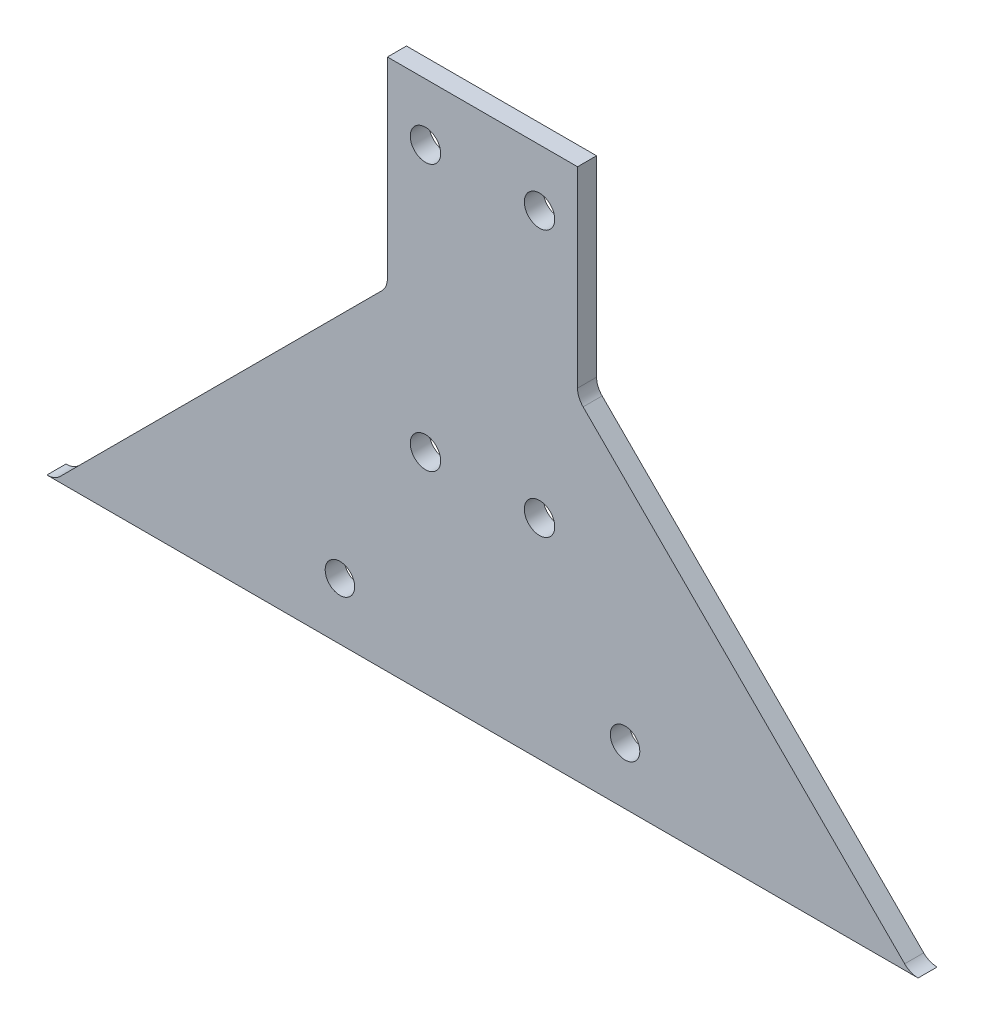
ISO-10303-21;
HEADER;
FILE_DESCRIPTION(('STEP AP214'),'2;1');
FILE_NAME('part.step','',(''),(''),'','','');
FILE_SCHEMA(('AUTOMOTIVE_DESIGN { 1 0 10303 214 1 1 1 1 }'));
ENDSEC;
DATA;
#1=APPLICATION_CONTEXT('core data for automotive mechanical design processes');
#2=APPLICATION_PROTOCOL_DEFINITION('international standard','automotive_design',2000,#1);
#3=PRODUCT_CONTEXT('',#1,'mechanical');
#4=PRODUCT('Part','Part','',(#3));
#5=PRODUCT_RELATED_PRODUCT_CATEGORY('part','',(#4));
#6=PRODUCT_DEFINITION_FORMATION('','',#4);
#7=PRODUCT_DEFINITION_CONTEXT('part definition',#1,'design');
#8=PRODUCT_DEFINITION('design','',#6,#7);
#9=PRODUCT_DEFINITION_SHAPE('','',#8);
#10=(LENGTH_UNIT() NAMED_UNIT(*) SI_UNIT(.MILLI.,.METRE.));
#11=(NAMED_UNIT(*) PLANE_ANGLE_UNIT() SI_UNIT($,.RADIAN.));
#12=(NAMED_UNIT(*) SI_UNIT($,.STERADIAN.) SOLID_ANGLE_UNIT());
#13=UNCERTAINTY_MEASURE_WITH_UNIT(LENGTH_MEASURE(1.E-05),#10,'distance_accuracy_value','');
#14=(GEOMETRIC_REPRESENTATION_CONTEXT(3) GLOBAL_UNCERTAINTY_ASSIGNED_CONTEXT((#13)) GLOBAL_UNIT_ASSIGNED_CONTEXT((#10,
#11,#12)) REPRESENTATION_CONTEXT('',''));
#15=CARTESIAN_POINT('',(0.,0.,0.));
#16=DIRECTION('',(0.,0.,1.));
#17=DIRECTION('',(1.,0.,0.));
#18=AXIS2_PLACEMENT_3D('',#15,#16,#17);
#19=CARTESIAN_POINT('',(0.,-56.,0.));
#20=DIRECTION('',(0.,1.,0.));
#21=DIRECTION('',(0.,0.,1.));
#22=AXIS2_PLACEMENT_3D('',#19,#20,#21);
#23=PLANE('',#22);
#24=DIRECTION('',(-1.,0.,0.));
#25=VECTOR('',#24,1.);
#26=CARTESIAN_POINT('',(0.,-56.,2.));
#27=LINE('',#26,#25);
#28=CARTESIAN_POINT('',(45.8284271247462,-56.,2.));
#29=VERTEX_POINT('',#28);
#30=CARTESIAN_POINT('',(-45.8284271247462,-56.,2.));
#31=VERTEX_POINT('',#30);
#32=EDGE_CURVE('E46',#29,#31,#27,.T.);
#33=ORIENTED_EDGE('',*,*,#32,.T.);
#34=DIRECTION('',(0.,0.,-1.));
#35=VECTOR('',#34,1.);
#36=CARTESIAN_POINT('',(-45.8284271247462,-56.,0.));
#37=LINE('',#36,#35);
#38=CARTESIAN_POINT('',(-45.8284271247462,-56.,0.));
#39=VERTEX_POINT('',#38);
#40=EDGE_CURVE('E11',#31,#39,#37,.T.);
#41=ORIENTED_EDGE('',*,*,#40,.T.);
#42=DIRECTION('',(-1.,0.,0.));
#43=VECTOR('',#42,1.);
#44=CARTESIAN_POINT('',(0.,-56.,0.));
#45=LINE('',#44,#43);
#46=CARTESIAN_POINT('',(45.8284271247462,-56.,0.));
#47=VERTEX_POINT('',#46);
#48=EDGE_CURVE('E59',#47,#39,#45,.T.);
#49=ORIENTED_EDGE('',*,*,#48,.F.);
#50=DIRECTION('',(0.,0.,-1.));
#51=VECTOR('',#50,1.);
#52=CARTESIAN_POINT('',(45.8284271247462,-56.,2.));
#53=LINE('',#52,#51);
#54=EDGE_CURVE('E51',#47,#29,#53,.F.);
#55=ORIENTED_EDGE('',*,*,#54,.T.);
#56=EDGE_LOOP('',(#33,#41,#49,#55));
#57=FACE_BOUND('',#56,.T.);
#58=ADVANCED_FACE('F43',(#57),#23,.F.);
#59=CARTESIAN_POINT('',(-15.,-50.,10.));
#60=DIRECTION('',(0.,0.,-1.));
#61=DIRECTION('',(-1.,0.,0.));
#62=AXIS2_PLACEMENT_3D('',#59,#60,#61);
#63=CYLINDRICAL_SURFACE('',#62,1.55);
#64=CARTESIAN_POINT('',(-15.,-50.,2.));
#65=DIRECTION('',(0.,0.,1.));
#66=DIRECTION('',(1.,0.,0.));
#67=AXIS2_PLACEMENT_3D('',#64,#65,#66);
#68=CIRCLE('',#67,1.55);
#69=CARTESIAN_POINT('',(-13.45,-50.,2.));
#70=VERTEX_POINT('',#69);
#71=EDGE_CURVE('E283',#70,#70,#68,.F.);
#72=ORIENTED_EDGE('',*,*,#71,.F.);
#73=EDGE_LOOP('',(#72));
#74=FACE_BOUND('',#73,.T.);
#75=CARTESIAN_POINT('',(-15.,-50.,0.));
#76=DIRECTION('',(0.,0.,-1.));
#77=DIRECTION('',(-1.,0.,0.));
#78=AXIS2_PLACEMENT_3D('',#75,#76,#77);
#79=CIRCLE('',#78,1.55);
#80=CARTESIAN_POINT('',(-16.55,-50.,0.));
#81=VERTEX_POINT('',#80);
#82=EDGE_CURVE('E294',#81,#81,#79,.F.);
#83=ORIENTED_EDGE('',*,*,#82,.F.);
#84=EDGE_LOOP('',(#83));
#85=FACE_BOUND('',#84,.T.);
#86=ADVANCED_FACE('F231',(#74,#85),#63,.F.);
#87=CARTESIAN_POINT('',(12.,-20.1715728752542,2.));
#88=DIRECTION('',(0.,0.,1.));
#89=DIRECTION('',(1.,0.,0.));
#90=AXIS2_PLACEMENT_3D('',#87,#88,#89);
#91=CYLINDRICAL_SURFACE('',#90,2.);
#92=CARTESIAN_POINT('',(12.,-20.1715728752542,2.));
#93=DIRECTION('',(0.,0.,1.));
#94=DIRECTION('',(1.,0.,0.));
#95=AXIS2_PLACEMENT_3D('',#92,#93,#94);
#96=CIRCLE('',#95,2.);
#97=CARTESIAN_POINT('',(10.5857864376269,-21.5857864376273,2.));
#98=VERTEX_POINT('',#97);
#99=CARTESIAN_POINT('',(10.,-20.1715728752542,2.));
#100=VERTEX_POINT('',#99);
#101=EDGE_CURVE('E129',#98,#100,#96,.F.);
#102=ORIENTED_EDGE('',*,*,#101,.F.);
#103=DIRECTION('',(0.,0.,-1.));
#104=VECTOR('',#103,1.);
#105=CARTESIAN_POINT('',(10.5857864376269,-21.5857864376273,2.));
#106=LINE('',#105,#104);
#107=CARTESIAN_POINT('',(10.5857864376269,-21.5857864376273,0.));
#108=VERTEX_POINT('',#107);
#109=EDGE_CURVE('E181',#108,#98,#106,.F.);
#110=ORIENTED_EDGE('',*,*,#109,.F.);
#111=CARTESIAN_POINT('',(12.,-20.1715728752542,0.));
#112=DIRECTION('',(0.,0.,1.));
#113=DIRECTION('',(1.,0.,0.));
#114=AXIS2_PLACEMENT_3D('',#111,#112,#113);
#115=CIRCLE('',#114,2.);
#116=CARTESIAN_POINT('',(10.,-20.1715728752542,0.));
#117=VERTEX_POINT('',#116);
#118=EDGE_CURVE('E193',#117,#108,#115,.T.);
#119=ORIENTED_EDGE('',*,*,#118,.F.);
#120=DIRECTION('',(0.,0.,-1.));
#121=VECTOR('',#120,1.);
#122=CARTESIAN_POINT('',(10.,-20.1715728752542,0.));
#123=LINE('',#122,#121);
#124=EDGE_CURVE('E176',#100,#117,#123,.T.);
#125=ORIENTED_EDGE('',*,*,#124,.F.);
#126=EDGE_LOOP('',(#102,#110,#119,#125));
#127=FACE_BOUND('',#126,.T.);
#128=ADVANCED_FACE('F237',(#127),#91,.F.);
#129=CARTESIAN_POINT('',(10.,0.,2.));
#130=DIRECTION('',(-1.,0.,0.));
#131=DIRECTION('',(0.,-1.,0.));
#132=AXIS2_PLACEMENT_3D('',#129,#130,#131);
#133=PLANE('',#132);
#134=DIRECTION('',(0.,1.,0.));
#135=VECTOR('',#134,1.);
#136=CARTESIAN_POINT('',(10.,0.,2.));
#137=LINE('',#136,#135);
#138=CARTESIAN_POINT('',(10.,0.,2.));
#139=VERTEX_POINT('',#138);
#140=EDGE_CURVE('E118',#100,#139,#137,.T.);
#141=ORIENTED_EDGE('',*,*,#140,.F.);
#142=ORIENTED_EDGE('',*,*,#124,.T.);
#143=DIRECTION('',(0.,1.,0.));
#144=VECTOR('',#143,1.);
#145=CARTESIAN_POINT('',(10.,0.,0.));
#146=LINE('',#145,#144);
#147=CARTESIAN_POINT('',(10.,0.,0.));
#148=VERTEX_POINT('',#147);
#149=EDGE_CURVE('E139',#117,#148,#146,.T.);
#150=ORIENTED_EDGE('',*,*,#149,.T.);
#151=DIRECTION('',(0.,0.,-1.));
#152=VECTOR('',#151,1.);
#153=CARTESIAN_POINT('',(10.,0.,2.));
#154=LINE('',#153,#152);
#155=EDGE_CURVE('E136',#139,#148,#154,.T.);
#156=ORIENTED_EDGE('',*,*,#155,.F.);
#157=EDGE_LOOP('',(#141,#142,#150,#156));
#158=FACE_BOUND('',#157,.T.);
#159=ADVANCED_FACE('F137',(#158),#133,.F.);
#160=CARTESIAN_POINT('',(10.,0.,2.));
#161=DIRECTION('',(0.,-1.,0.));
#162=DIRECTION('',(0.,0.,-1.));
#163=AXIS2_PLACEMENT_3D('',#160,#161,#162);
#164=PLANE('',#163);
#165=DIRECTION('',(-1.,0.,0.));
#166=VECTOR('',#165,1.);
#167=CARTESIAN_POINT('',(10.,0.,0.));
#168=LINE('',#167,#166);
#169=CARTESIAN_POINT('',(-10.,0.,0.));
#170=VERTEX_POINT('',#169);
#171=EDGE_CURVE('E161',#148,#170,#168,.T.);
#172=ORIENTED_EDGE('',*,*,#171,.T.);
#173=DIRECTION('',(0.,0.,-1.));
#174=VECTOR('',#173,1.);
#175=CARTESIAN_POINT('',(-10.,0.,2.));
#176=LINE('',#175,#174);
#177=CARTESIAN_POINT('',(-10.,0.,2.));
#178=VERTEX_POINT('',#177);
#179=EDGE_CURVE('E143',#178,#170,#176,.T.);
#180=ORIENTED_EDGE('',*,*,#179,.F.);
#181=DIRECTION('',(-1.,0.,0.));
#182=VECTOR('',#181,1.);
#183=CARTESIAN_POINT('',(10.,0.,2.));
#184=LINE('',#183,#182);
#185=EDGE_CURVE('E125',#139,#178,#184,.T.);
#186=ORIENTED_EDGE('',*,*,#185,.F.);
#187=ORIENTED_EDGE('',*,*,#155,.T.);
#188=EDGE_LOOP('',(#172,#180,#186,#187));
#189=FACE_BOUND('',#188,.T.);
#190=ADVANCED_FACE('F145',(#189),#164,.F.);
#191=CARTESIAN_POINT('',(-10.,0.,2.));
#192=DIRECTION('',(1.,0.,0.));
#193=DIRECTION('',(0.,1.,0.));
#194=AXIS2_PLACEMENT_3D('',#191,#192,#193);
#195=PLANE('',#194);
#196=DIRECTION('',(0.,-1.,0.));
#197=VECTOR('',#196,1.);
#198=CARTESIAN_POINT('',(-10.,0.,0.));
#199=LINE('',#198,#197);
#200=CARTESIAN_POINT('',(-10.,-20.1715728752542,0.));
#201=VERTEX_POINT('',#200);
#202=EDGE_CURVE('E163',#170,#201,#199,.T.);
#203=ORIENTED_EDGE('',*,*,#202,.T.);
#204=DIRECTION('',(0.,0.,-1.));
#205=VECTOR('',#204,1.);
#206=CARTESIAN_POINT('',(-10.,-20.1715728752542,2.));
#207=LINE('',#206,#205);
#208=CARTESIAN_POINT('',(-10.,-20.1715728752542,2.));
#209=VERTEX_POINT('',#208);
#210=EDGE_CURVE('E174',#201,#209,#207,.F.);
#211=ORIENTED_EDGE('',*,*,#210,.T.);
#212=DIRECTION('',(0.,-1.,0.));
#213=VECTOR('',#212,1.);
#214=CARTESIAN_POINT('',(-10.,0.,2.));
#215=LINE('',#214,#213);
#216=EDGE_CURVE('E148',#178,#209,#215,.T.);
#217=ORIENTED_EDGE('',*,*,#216,.F.);
#218=ORIENTED_EDGE('',*,*,#179,.T.);
#219=EDGE_LOOP('',(#203,#211,#217,#218));
#220=FACE_BOUND('',#219,.T.);
#221=ADVANCED_FACE('F219',(#220),#195,.F.);
#222=CARTESIAN_POINT('',(-12.,-20.1715728752542,2.));
#223=DIRECTION('',(0.,0.,1.));
#224=DIRECTION('',(1.,0.,0.));
#225=AXIS2_PLACEMENT_3D('',#222,#223,#224);
#226=CYLINDRICAL_SURFACE('',#225,2.);
#227=CARTESIAN_POINT('',(-12.,-20.1715728752542,2.));
#228=DIRECTION('',(0.,0.,1.));
#229=DIRECTION('',(1.,0.,0.));
#230=AXIS2_PLACEMENT_3D('',#227,#228,#229);
#231=CIRCLE('',#230,2.);
#232=CARTESIAN_POINT('',(-10.5857864376269,-21.5857864376273,2.));
#233=VERTEX_POINT('',#232);
#234=EDGE_CURVE('E191',#209,#233,#231,.F.);
#235=ORIENTED_EDGE('',*,*,#234,.F.);
#236=ORIENTED_EDGE('',*,*,#210,.F.);
#237=CARTESIAN_POINT('',(-12.,-20.1715728752542,0.));
#238=DIRECTION('',(0.,0.,1.));
#239=DIRECTION('',(1.,0.,0.));
#240=AXIS2_PLACEMENT_3D('',#237,#238,#239);
#241=CIRCLE('',#240,2.);
#242=CARTESIAN_POINT('',(-10.5857864376269,-21.5857864376273,0.));
#243=VERTEX_POINT('',#242);
#244=EDGE_CURVE('E189',#243,#201,#241,.T.);
#245=ORIENTED_EDGE('',*,*,#244,.F.);
#246=DIRECTION('',(0.,0.,-1.));
#247=VECTOR('',#246,1.);
#248=CARTESIAN_POINT('',(-10.5857864376269,-21.5857864376273,0.));
#249=LINE('',#248,#247);
#250=EDGE_CURVE('E142',#233,#243,#249,.T.);
#251=ORIENTED_EDGE('',*,*,#250,.F.);
#252=EDGE_LOOP('',(#235,#236,#245,#251));
#253=FACE_BOUND('',#252,.T.);
#254=ADVANCED_FACE('F215',(#253),#226,.F.);
#255=CARTESIAN_POINT('',(6.,-6.,2.));
#256=DIRECTION('',(0.,0.,-1.));
#257=DIRECTION('',(-1.,0.,0.));
#258=AXIS2_PLACEMENT_3D('',#255,#256,#257);
#259=CYLINDRICAL_SURFACE('',#258,1.6);
#260=CARTESIAN_POINT('',(6.,-6.,2.));
#261=DIRECTION('',(0.,0.,-1.));
#262=DIRECTION('',(1.,0.,0.));
#263=AXIS2_PLACEMENT_3D('',#260,#261,#262);
#264=CIRCLE('',#263,1.6);
#265=CARTESIAN_POINT('',(7.6,-6.,2.));
#266=VERTEX_POINT('',#265);
#267=EDGE_CURVE('E272',#266,#266,#264,.T.);
#268=ORIENTED_EDGE('',*,*,#267,.F.);
#269=EDGE_LOOP('',(#268));
#270=FACE_BOUND('',#269,.T.);
#271=CARTESIAN_POINT('',(6.,-6.,0.));
#272=DIRECTION('',(0.,0.,-1.));
#273=DIRECTION('',(1.,0.,0.));
#274=AXIS2_PLACEMENT_3D('',#271,#272,#273);
#275=CIRCLE('',#274,1.6);
#276=CARTESIAN_POINT('',(7.6,-6.,0.));
#277=VERTEX_POINT('',#276);
#278=EDGE_CURVE('E280',#277,#277,#275,.T.);
#279=ORIENTED_EDGE('',*,*,#278,.T.);
#280=EDGE_LOOP('',(#279));
#281=FACE_BOUND('',#280,.T.);
#282=ADVANCED_FACE('F225',(#270,#281),#259,.F.);
#283=CARTESIAN_POINT('',(-6.,-6.,2.));
#284=DIRECTION('',(0.,0.,-1.));
#285=DIRECTION('',(-1.,0.,0.));
#286=AXIS2_PLACEMENT_3D('',#283,#284,#285);
#287=CYLINDRICAL_SURFACE('',#286,1.6);
#288=CARTESIAN_POINT('',(-6.,-6.,2.));
#289=DIRECTION('',(0.,0.,-1.));
#290=DIRECTION('',(-1.,0.,0.));
#291=AXIS2_PLACEMENT_3D('',#288,#289,#290);
#292=CIRCLE('',#291,1.6);
#293=CARTESIAN_POINT('',(-7.6,-6.,2.));
#294=VERTEX_POINT('',#293);
#295=EDGE_CURVE('E159',#294,#294,#292,.T.);
#296=ORIENTED_EDGE('',*,*,#295,.F.);
#297=EDGE_LOOP('',(#296));
#298=FACE_BOUND('',#297,.T.);
#299=CARTESIAN_POINT('',(-6.,-6.,0.));
#300=DIRECTION('',(0.,0.,-1.));
#301=DIRECTION('',(-1.,0.,0.));
#302=AXIS2_PLACEMENT_3D('',#299,#300,#301);
#303=CIRCLE('',#302,1.6);
#304=CARTESIAN_POINT('',(-7.6,-6.,0.));
#305=VERTEX_POINT('',#304);
#306=EDGE_CURVE('E262',#305,#305,#303,.T.);
#307=ORIENTED_EDGE('',*,*,#306,.T.);
#308=EDGE_LOOP('',(#307));
#309=FACE_BOUND('',#308,.T.);
#310=ADVANCED_FACE('F328',(#298,#309),#287,.F.);
#311=CARTESIAN_POINT('',(-6.00000000000001,-34.,2.));
#312=DIRECTION('',(0.,0.,-1.));
#313=DIRECTION('',(-1.,0.,0.));
#314=AXIS2_PLACEMENT_3D('',#311,#312,#313);
#315=CYLINDRICAL_SURFACE('',#314,1.6);
#316=CARTESIAN_POINT('',(-6.00000000000001,-34.,2.));
#317=DIRECTION('',(0.,0.,-1.));
#318=DIRECTION('',(-1.,0.,0.));
#319=AXIS2_PLACEMENT_3D('',#316,#317,#318);
#320=CIRCLE('',#319,1.6);
#321=CARTESIAN_POINT('',(-7.60000000000001,-34.,2.));
#322=VERTEX_POINT('',#321);
#323=EDGE_CURVE('E265',#322,#322,#320,.T.);
#324=ORIENTED_EDGE('',*,*,#323,.F.);
#325=EDGE_LOOP('',(#324));
#326=FACE_BOUND('',#325,.T.);
#327=CARTESIAN_POINT('',(-6.00000000000001,-34.,0.));
#328=DIRECTION('',(0.,0.,-1.));
#329=DIRECTION('',(-1.,0.,0.));
#330=AXIS2_PLACEMENT_3D('',#327,#328,#329);
#331=CIRCLE('',#330,1.6);
#332=CARTESIAN_POINT('',(-7.60000000000001,-34.,0.));
#333=VERTEX_POINT('',#332);
#334=EDGE_CURVE('E275',#333,#333,#331,.T.);
#335=ORIENTED_EDGE('',*,*,#334,.T.);
#336=EDGE_LOOP('',(#335));
#337=FACE_BOUND('',#336,.T.);
#338=ADVANCED_FACE('F321',(#326,#337),#315,.F.);
#339=CARTESIAN_POINT('',(6.,-34.,2.));
#340=DIRECTION('',(0.,0.,-1.));
#341=DIRECTION('',(-1.,0.,0.));
#342=AXIS2_PLACEMENT_3D('',#339,#340,#341);
#343=CYLINDRICAL_SURFACE('',#342,1.6);
#344=CARTESIAN_POINT('',(6.,-34.,2.));
#345=DIRECTION('',(0.,0.,-1.));
#346=DIRECTION('',(1.,0.,0.));
#347=AXIS2_PLACEMENT_3D('',#344,#345,#346);
#348=CIRCLE('',#347,1.6);
#349=CARTESIAN_POINT('',(7.6,-34.,2.));
#350=VERTEX_POINT('',#349);
#351=EDGE_CURVE('E271',#350,#350,#348,.T.);
#352=ORIENTED_EDGE('',*,*,#351,.F.);
#353=EDGE_LOOP('',(#352));
#354=FACE_BOUND('',#353,.T.);
#355=CARTESIAN_POINT('',(6.,-34.,0.));
#356=DIRECTION('',(0.,0.,-1.));
#357=DIRECTION('',(1.,0.,0.));
#358=AXIS2_PLACEMENT_3D('',#355,#356,#357);
#359=CIRCLE('',#358,1.6);
#360=CARTESIAN_POINT('',(7.6,-34.,0.));
#361=VERTEX_POINT('',#360);
#362=EDGE_CURVE('E268',#361,#361,#359,.T.);
#363=ORIENTED_EDGE('',*,*,#362,.T.);
#364=EDGE_LOOP('',(#363));
#365=FACE_BOUND('',#364,.T.);
#366=ADVANCED_FACE('F315',(#354,#365),#343,.F.);
#367=CARTESIAN_POINT('',(15.,-50.,10.));
#368=DIRECTION('',(0.,0.,-1.));
#369=DIRECTION('',(-1.,0.,0.));
#370=AXIS2_PLACEMENT_3D('',#367,#368,#369);
#371=CYLINDRICAL_SURFACE('',#370,1.55);
#372=CARTESIAN_POINT('',(15.,-50.,2.));
#373=DIRECTION('',(0.,0.,1.));
#374=DIRECTION('',(1.,0.,0.));
#375=AXIS2_PLACEMENT_3D('',#372,#373,#374);
#376=CIRCLE('',#375,1.55);
#377=CARTESIAN_POINT('',(16.55,-50.,2.));
#378=VERTEX_POINT('',#377);
#379=EDGE_CURVE('E288',#378,#378,#376,.T.);
#380=ORIENTED_EDGE('',*,*,#379,.T.);
#381=EDGE_LOOP('',(#380));
#382=FACE_BOUND('',#381,.T.);
#383=CARTESIAN_POINT('',(15.,-50.,0.));
#384=DIRECTION('',(0.,0.,-1.));
#385=DIRECTION('',(-1.,0.,0.));
#386=AXIS2_PLACEMENT_3D('',#383,#384,#385);
#387=CIRCLE('',#386,1.55);
#388=CARTESIAN_POINT('',(13.45,-50.,0.));
#389=VERTEX_POINT('',#388);
#390=EDGE_CURVE('E291',#389,#389,#387,.T.);
#391=ORIENTED_EDGE('',*,*,#390,.T.);
#392=EDGE_LOOP('',(#391));
#393=FACE_BOUND('',#392,.T.);
#394=ADVANCED_FACE('F311',(#382,#393),#371,.F.);
#395=CARTESIAN_POINT('',(-10.,-21.0000000000004,2.));
#396=DIRECTION('',(0.707106781186544,-0.707106781186551,0.));
#397=DIRECTION('',(0.707106781186551,0.707106781186544,0.));
#398=AXIS2_PLACEMENT_3D('',#395,#396,#397);
#399=PLANE('',#398);
#400=DIRECTION('',(-0.707106781186551,-0.707106781186544,0.));
#401=VECTOR('',#400,1.);
#402=CARTESIAN_POINT('',(-10.,-21.0000000000004,0.));
#403=LINE('',#402,#401);
#404=CARTESIAN_POINT('',(-44.4142135623731,-55.4142135623731,0.));
#405=VERTEX_POINT('',#404);
#406=EDGE_CURVE('E166',#243,#405,#403,.T.);
#407=ORIENTED_EDGE('',*,*,#406,.T.);
#408=DIRECTION('',(0.,0.,-1.));
#409=VECTOR('',#408,1.);
#410=CARTESIAN_POINT('',(-44.4142135623731,-55.4142135623731,2.));
#411=LINE('',#410,#409);
#412=CARTESIAN_POINT('',(-44.4142135623731,-55.4142135623731,2.));
#413=VERTEX_POINT('',#412);
#414=EDGE_CURVE('E172',#405,#413,#411,.F.);
#415=ORIENTED_EDGE('',*,*,#414,.T.);
#416=DIRECTION('',(-0.707106781186551,-0.707106781186544,0.));
#417=VECTOR('',#416,1.);
#418=CARTESIAN_POINT('',(-10.,-21.0000000000004,2.));
#419=LINE('',#418,#417);
#420=EDGE_CURVE('E150',#233,#413,#419,.T.);
#421=ORIENTED_EDGE('',*,*,#420,.F.);
#422=ORIENTED_EDGE('',*,*,#250,.T.);
#423=EDGE_LOOP('',(#407,#415,#421,#422));
#424=FACE_BOUND('',#423,.T.);
#425=ADVANCED_FACE('F211',(#424),#399,.F.);
#426=CARTESIAN_POINT('',(10.,-21.0000000000004,2.));
#427=DIRECTION('',(-0.707106781186544,-0.707106781186551,0.));
#428=DIRECTION('',(0.707106781186551,-0.707106781186544,0.));
#429=AXIS2_PLACEMENT_3D('',#426,#427,#428);
#430=PLANE('',#429);
#431=DIRECTION('',(-0.707106781186552,0.707106781186544,0.));
#432=VECTOR('',#431,1.);
#433=CARTESIAN_POINT('',(10.,-21.0000000000004,0.));
#434=LINE('',#433,#432);
#435=CARTESIAN_POINT('',(44.4142135623731,-55.4142135623731,0.));
#436=VERTEX_POINT('',#435);
#437=EDGE_CURVE('E156',#436,#108,#434,.T.);
#438=ORIENTED_EDGE('',*,*,#437,.T.);
#439=ORIENTED_EDGE('',*,*,#109,.T.);
#440=DIRECTION('',(-0.707106781186552,0.707106781186544,0.));
#441=VECTOR('',#440,1.);
#442=CARTESIAN_POINT('',(10.,-21.0000000000004,2.));
#443=LINE('',#442,#441);
#444=CARTESIAN_POINT('',(44.4142135623731,-55.4142135623731,2.));
#445=VERTEX_POINT('',#444);
#446=EDGE_CURVE('E133',#445,#98,#443,.T.);
#447=ORIENTED_EDGE('',*,*,#446,.F.);
#448=DIRECTION('',(0.,0.,-1.));
#449=VECTOR('',#448,1.);
#450=CARTESIAN_POINT('',(44.4142135623731,-55.4142135623731,0.));
#451=LINE('',#450,#449);
#452=EDGE_CURVE('E178',#445,#436,#451,.T.);
#453=ORIENTED_EDGE('',*,*,#452,.T.);
#454=EDGE_LOOP('',(#438,#439,#447,#453));
#455=FACE_BOUND('',#454,.T.);
#456=ADVANCED_FACE('F247',(#455),#430,.F.);
#457=CARTESIAN_POINT('',(0.,0.,0.));
#458=DIRECTION('',(0.,0.,1.));
#459=DIRECTION('',(1.,0.,0.));
#460=AXIS2_PLACEMENT_3D('',#457,#458,#459);
#461=PLANE('',#460);
#462=ORIENTED_EDGE('',*,*,#390,.F.);
#463=EDGE_LOOP('',(#462));
#464=FACE_BOUND('',#463,.T.);
#465=ORIENTED_EDGE('',*,*,#362,.F.);
#466=EDGE_LOOP('',(#465));
#467=FACE_BOUND('',#466,.T.);
#468=ORIENTED_EDGE('',*,*,#334,.F.);
#469=EDGE_LOOP('',(#468));
#470=FACE_BOUND('',#469,.T.);
#471=ORIENTED_EDGE('',*,*,#306,.F.);
#472=EDGE_LOOP('',(#471));
#473=FACE_BOUND('',#472,.T.);
#474=ORIENTED_EDGE('',*,*,#278,.F.);
#475=EDGE_LOOP('',(#474));
#476=FACE_BOUND('',#475,.T.);
#477=CARTESIAN_POINT('',(45.8284271247462,-54.,0.));
#478=DIRECTION('',(0.,0.,1.));
#479=DIRECTION('',(1.,0.,0.));
#480=AXIS2_PLACEMENT_3D('',#477,#478,#479);
#481=CIRCLE('',#480,2.);
#482=EDGE_CURVE('E196',#436,#47,#481,.T.);
#483=ORIENTED_EDGE('',*,*,#482,.T.);
#484=ORIENTED_EDGE('',*,*,#48,.T.);
#485=CARTESIAN_POINT('',(-45.8284271247462,-54.,0.));
#486=DIRECTION('',(0.,0.,1.));
#487=DIRECTION('',(1.,0.,0.));
#488=AXIS2_PLACEMENT_3D('',#485,#486,#487);
#489=CIRCLE('',#488,2.);
#490=EDGE_CURVE('E183',#39,#405,#489,.T.);
#491=ORIENTED_EDGE('',*,*,#490,.T.);
#492=ORIENTED_EDGE('',*,*,#406,.F.);
#493=ORIENTED_EDGE('',*,*,#244,.T.);
#494=ORIENTED_EDGE('',*,*,#202,.F.);
#495=ORIENTED_EDGE('',*,*,#171,.F.);
#496=ORIENTED_EDGE('',*,*,#149,.F.);
#497=ORIENTED_EDGE('',*,*,#118,.T.);
#498=ORIENTED_EDGE('',*,*,#437,.F.);
#499=EDGE_LOOP('',(#483,#484,#491,#492,#493,#494,#495,#496,#497,#498));
#500=FACE_BOUND('',#499,.T.);
#501=ORIENTED_EDGE('',*,*,#82,.T.);
#502=EDGE_LOOP('',(#501));
#503=FACE_BOUND('',#502,.T.);
#504=ADVANCED_FACE('F208',(#464,#467,#470,#473,#476,#500,#503),#461,.F.);
#505=CARTESIAN_POINT('',(0.,0.,2.));
#506=DIRECTION('',(0.,0.,1.));
#507=DIRECTION('',(1.,0.,0.));
#508=AXIS2_PLACEMENT_3D('',#505,#506,#507);
#509=PLANE('',#508);
#510=ORIENTED_EDGE('',*,*,#32,.F.);
#511=CARTESIAN_POINT('',(45.8284271247462,-54.,2.));
#512=DIRECTION('',(0.,0.,1.));
#513=DIRECTION('',(1.,0.,0.));
#514=AXIS2_PLACEMENT_3D('',#511,#512,#513);
#515=CIRCLE('',#514,2.);
#516=EDGE_CURVE('E198',#29,#445,#515,.F.);
#517=ORIENTED_EDGE('',*,*,#516,.T.);
#518=ORIENTED_EDGE('',*,*,#446,.T.);
#519=ORIENTED_EDGE('',*,*,#101,.T.);
#520=ORIENTED_EDGE('',*,*,#140,.T.);
#521=ORIENTED_EDGE('',*,*,#185,.T.);
#522=ORIENTED_EDGE('',*,*,#216,.T.);
#523=ORIENTED_EDGE('',*,*,#234,.T.);
#524=ORIENTED_EDGE('',*,*,#420,.T.);
#525=CARTESIAN_POINT('',(-45.8284271247462,-54.,2.));
#526=DIRECTION('',(0.,0.,1.));
#527=DIRECTION('',(1.,0.,0.));
#528=AXIS2_PLACEMENT_3D('',#525,#526,#527);
#529=CIRCLE('',#528,2.);
#530=EDGE_CURVE('E186',#413,#31,#529,.F.);
#531=ORIENTED_EDGE('',*,*,#530,.T.);
#532=EDGE_LOOP('',(#510,#517,#518,#519,#520,#521,#522,#523,#524,#531));
#533=FACE_BOUND('',#532,.T.);
#534=ORIENTED_EDGE('',*,*,#379,.F.);
#535=EDGE_LOOP('',(#534));
#536=FACE_BOUND('',#535,.T.);
#537=ORIENTED_EDGE('',*,*,#351,.T.);
#538=EDGE_LOOP('',(#537));
#539=FACE_BOUND('',#538,.T.);
#540=ORIENTED_EDGE('',*,*,#323,.T.);
#541=EDGE_LOOP('',(#540));
#542=FACE_BOUND('',#541,.T.);
#543=ORIENTED_EDGE('',*,*,#295,.T.);
#544=EDGE_LOOP('',(#543));
#545=FACE_BOUND('',#544,.T.);
#546=ORIENTED_EDGE('',*,*,#267,.T.);
#547=EDGE_LOOP('',(#546));
#548=FACE_BOUND('',#547,.T.);
#549=ORIENTED_EDGE('',*,*,#71,.T.);
#550=EDGE_LOOP('',(#549));
#551=FACE_BOUND('',#550,.T.);
#552=ADVANCED_FACE('F121',(#533,#536,#539,#542,#545,#548,#551),#509,.T.);
#553=CARTESIAN_POINT('',(45.8284271247462,-54.,2.));
#554=DIRECTION('',(0.,0.,1.));
#555=DIRECTION('',(1.,0.,0.));
#556=AXIS2_PLACEMENT_3D('',#553,#554,#555);
#557=CYLINDRICAL_SURFACE('',#556,2.);
#558=ORIENTED_EDGE('',*,*,#516,.F.);
#559=ORIENTED_EDGE('',*,*,#54,.F.);
#560=ORIENTED_EDGE('',*,*,#482,.F.);
#561=ORIENTED_EDGE('',*,*,#452,.F.);
#562=EDGE_LOOP('',(#558,#559,#560,#561));
#563=FACE_BOUND('',#562,.T.);
#564=ADVANCED_FACE('F241',(#563),#557,.F.);
#565=CARTESIAN_POINT('',(-45.8284271247462,-54.,2.));
#566=DIRECTION('',(0.,0.,1.));
#567=DIRECTION('',(1.,0.,0.));
#568=AXIS2_PLACEMENT_3D('',#565,#566,#567);
#569=CYLINDRICAL_SURFACE('',#568,2.);
#570=ORIENTED_EDGE('',*,*,#530,.F.);
#571=ORIENTED_EDGE('',*,*,#414,.F.);
#572=ORIENTED_EDGE('',*,*,#490,.F.);
#573=ORIENTED_EDGE('',*,*,#40,.F.);
#574=EDGE_LOOP('',(#570,#571,#572,#573));
#575=FACE_BOUND('',#574,.T.);
#576=ADVANCED_FACE('F206',(#575),#569,.F.);
#577=CLOSED_SHELL('',(#58,#86,#128,#159,#190,#221,#254,#282,#310,#338,#366,#394,#425,#456,#504,
#552,#564,#576));
#578=MANIFOLD_SOLID_BREP('B2',#577);
#579=ADVANCED_BREP_SHAPE_REPRESENTATION('',(#18,#578),#14);
#580=SHAPE_DEFINITION_REPRESENTATION(#9,#579);
ENDSEC;
END-ISO-10303-21;
